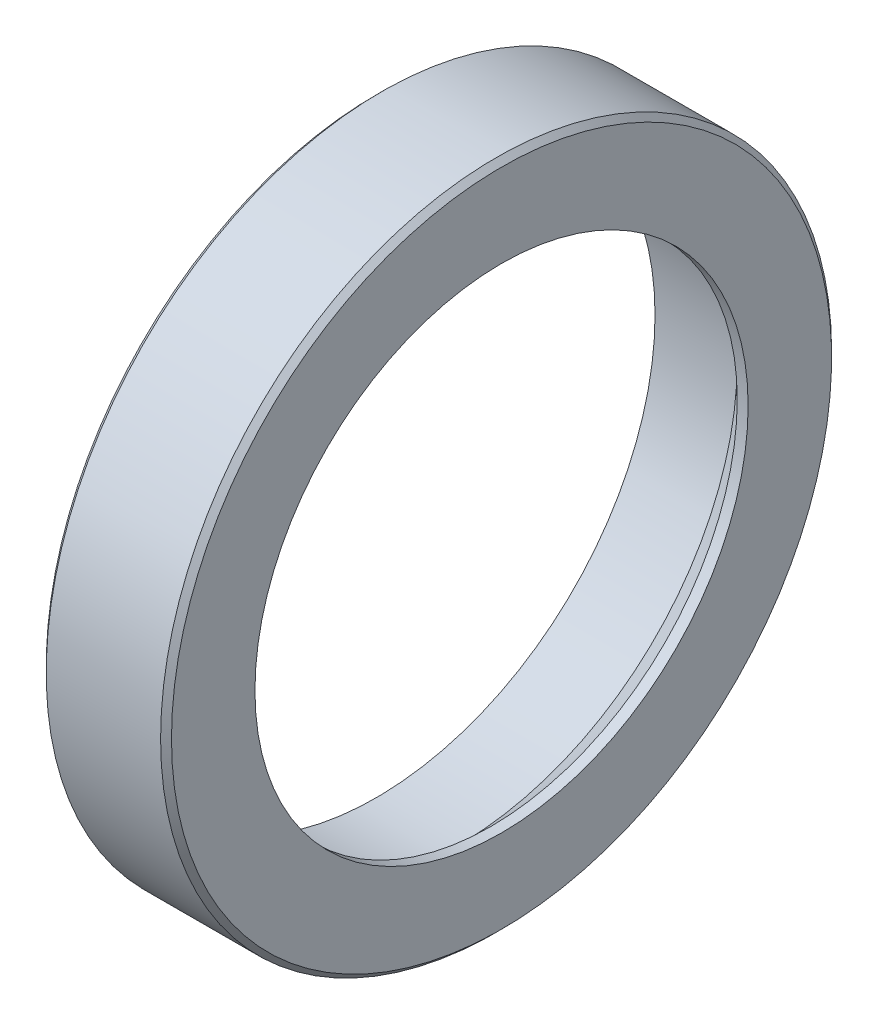
ISO-10303-21;
HEADER;
FILE_DESCRIPTION(('STEP AP214'),'2;1');
FILE_NAME('part.step','',(''),(''),'','','');
FILE_SCHEMA(('AUTOMOTIVE_DESIGN { 1 0 10303 214 1 1 1 1 }'));
ENDSEC;
DATA;
#1=APPLICATION_CONTEXT('core data for automotive mechanical design processes');
#2=APPLICATION_PROTOCOL_DEFINITION('international standard','automotive_design',2000,#1);
#3=PRODUCT_CONTEXT('',#1,'mechanical');
#4=PRODUCT('Part','Part','',(#3));
#5=PRODUCT_RELATED_PRODUCT_CATEGORY('part','',(#4));
#6=PRODUCT_DEFINITION_FORMATION('','',#4);
#7=PRODUCT_DEFINITION_CONTEXT('part definition',#1,'design');
#8=PRODUCT_DEFINITION('design','',#6,#7);
#9=PRODUCT_DEFINITION_SHAPE('','',#8);
#10=(LENGTH_UNIT() NAMED_UNIT(*) SI_UNIT(.MILLI.,.METRE.));
#11=(NAMED_UNIT(*) PLANE_ANGLE_UNIT() SI_UNIT($,.RADIAN.));
#12=(NAMED_UNIT(*) SI_UNIT($,.STERADIAN.) SOLID_ANGLE_UNIT());
#13=UNCERTAINTY_MEASURE_WITH_UNIT(LENGTH_MEASURE(1.E-05),#10,'distance_accuracy_value','');
#14=(GEOMETRIC_REPRESENTATION_CONTEXT(3) GLOBAL_UNCERTAINTY_ASSIGNED_CONTEXT((#13)) GLOBAL_UNIT_ASSIGNED_CONTEXT((#10,
#11,#12)) REPRESENTATION_CONTEXT('',''));
#15=CARTESIAN_POINT('',(0.,0.,0.));
#16=DIRECTION('',(0.,0.,1.));
#17=DIRECTION('',(1.,0.,0.));
#18=AXIS2_PLACEMENT_3D('',#15,#16,#17);
#19=CARTESIAN_POINT('',(61.6210605092657,0.,0.));
#20=DIRECTION('',(-1.,0.,0.));
#21=DIRECTION('',(0.,0.,1.));
#22=AXIS2_PLACEMENT_3D('',#19,#20,#21);
#23=CONICAL_SURFACE('',#22,19.5,0.785398163397447);
#24=CARTESIAN_POINT('',(61.6210605092657,0.,0.));
#25=DIRECTION('',(1.,0.,0.));
#26=DIRECTION('',(0.,0.,-1.));
#27=AXIS2_PLACEMENT_3D('',#24,#25,#26);
#28=CIRCLE('',#27,19.5);
#29=CARTESIAN_POINT('',(61.6210605092657,0.,-19.5));
#30=VERTEX_POINT('',#29);
#31=EDGE_CURVE('E34',#30,#30,#28,.F.);
#32=ORIENTED_EDGE('',*,*,#31,.T.);
#33=EDGE_LOOP('',(#32));
#34=FACE_BOUND('',#33,.T.);
#35=CARTESIAN_POINT('',(63.8710605092657,0.,0.));
#36=DIRECTION('',(1.,0.,0.));
#37=DIRECTION('',(0.,0.,-1.));
#38=AXIS2_PLACEMENT_3D('',#35,#36,#37);
#39=CIRCLE('',#38,17.25);
#40=CARTESIAN_POINT('',(63.8710605092657,0.,-17.25));
#41=VERTEX_POINT('',#40);
#42=EDGE_CURVE('E37',#41,#41,#39,.T.);
#43=ORIENTED_EDGE('',*,*,#42,.T.);
#44=EDGE_LOOP('',(#43));
#45=FACE_BOUND('',#44,.T.);
#46=ADVANCED_FACE('F15',(#34,#45),#23,.F.);
#47=CARTESIAN_POINT('',(64.2520605092657,0.,0.));
#48=DIRECTION('',(1.,0.,0.));
#49=DIRECTION('',(0.,0.,-1.));
#50=AXIS2_PLACEMENT_3D('',#47,#48,#49);
#51=CYLINDRICAL_SURFACE('',#50,17.25);
#52=ORIENTED_EDGE('',*,*,#42,.F.);
#53=EDGE_LOOP('',(#52));
#54=FACE_BOUND('',#53,.T.);
#55=CARTESIAN_POINT('',(64.6330605092657,0.,0.));
#56=DIRECTION('',(1.,0.,0.));
#57=DIRECTION('',(0.,0.,-1.));
#58=AXIS2_PLACEMENT_3D('',#55,#56,#57);
#59=CIRCLE('',#58,17.25);
#60=CARTESIAN_POINT('',(64.6330605092657,0.,-17.25));
#61=VERTEX_POINT('',#60);
#62=EDGE_CURVE('E18',#61,#61,#59,.F.);
#63=ORIENTED_EDGE('',*,*,#62,.F.);
#64=EDGE_LOOP('',(#63));
#65=FACE_BOUND('',#64,.T.);
#66=ADVANCED_FACE('F54',(#54,#65),#51,.F.);
#67=CARTESIAN_POINT('',(58.7455486871305,0.,0.));
#68=DIRECTION('',(1.,0.,0.));
#69=DIRECTION('',(0.,0.,-1.));
#70=AXIS2_PLACEMENT_3D('',#67,#68,#69);
#71=CYLINDRICAL_SURFACE('',#70,19.5);
#72=CARTESIAN_POINT('',(55.8700368649953,0.,0.));
#73=DIRECTION('',(1.,0.,0.));
#74=DIRECTION('',(0.,0.,-1.));
#75=AXIS2_PLACEMENT_3D('',#72,#73,#74);
#76=CIRCLE('',#75,19.5);
#77=CARTESIAN_POINT('',(55.8700368649953,0.,-19.5));
#78=VERTEX_POINT('',#77);
#79=EDGE_CURVE('E44',#78,#78,#76,.T.);
#80=ORIENTED_EDGE('',*,*,#79,.F.);
#81=EDGE_LOOP('',(#80));
#82=FACE_BOUND('',#81,.T.);
#83=ORIENTED_EDGE('',*,*,#31,.F.);
#84=EDGE_LOOP('',(#83));
#85=FACE_BOUND('',#84,.T.);
#86=ADVANCED_FACE('F56',(#82,#85),#71,.F.);
#87=CARTESIAN_POINT('',(64.6330605092657,17.25,0.));
#88=DIRECTION('',(1.,0.,0.));
#89=DIRECTION('',(0.,0.,-1.));
#90=AXIS2_PLACEMENT_3D('',#87,#88,#89);
#91=PLANE('',#90);
#92=ORIENTED_EDGE('',*,*,#62,.T.);
#93=EDGE_LOOP('',(#92));
#94=FACE_BOUND('',#93,.T.);
#95=CARTESIAN_POINT('',(64.6330605092657,0.,0.));
#96=DIRECTION('',(-1.,0.,0.));
#97=DIRECTION('',(0.,0.,1.));
#98=AXIS2_PLACEMENT_3D('',#95,#96,#97);
#99=CIRCLE('',#98,23.0886);
#100=CARTESIAN_POINT('',(64.6330605092657,0.,23.0886));
#101=VERTEX_POINT('',#100);
#102=EDGE_CURVE('E42',#101,#101,#99,.T.);
#103=ORIENTED_EDGE('',*,*,#102,.F.);
#104=EDGE_LOOP('',(#103));
#105=FACE_BOUND('',#104,.T.);
#106=ADVANCED_FACE('F51',(#94,#105),#91,.T.);
#107=CARTESIAN_POINT('',(55.8700368649953,23.4696,0.));
#108=DIRECTION('',(-1.,0.,0.));
#109=DIRECTION('',(0.,0.,1.));
#110=AXIS2_PLACEMENT_3D('',#107,#108,#109);
#111=PLANE('',#110);
#112=ORIENTED_EDGE('',*,*,#79,.T.);
#113=EDGE_LOOP('',(#112));
#114=FACE_BOUND('',#113,.T.);
#115=CARTESIAN_POINT('',(55.8700368649953,0.,0.));
#116=DIRECTION('',(1.,0.,0.));
#117=DIRECTION('',(0.,0.,-1.));
#118=AXIS2_PLACEMENT_3D('',#115,#116,#117);
#119=CIRCLE('',#118,23.0886);
#120=CARTESIAN_POINT('',(55.8700368649953,0.,-23.0886));
#121=VERTEX_POINT('',#120);
#122=EDGE_CURVE('E27',#121,#121,#119,.T.);
#123=ORIENTED_EDGE('',*,*,#122,.F.);
#124=EDGE_LOOP('',(#123));
#125=FACE_BOUND('',#124,.T.);
#126=ADVANCED_FACE('F81',(#114,#125),#111,.T.);
#127=CARTESIAN_POINT('',(64.2520605092657,0.,0.));
#128=DIRECTION('',(-1.,0.,0.));
#129=DIRECTION('',(0.,0.,1.));
#130=AXIS2_PLACEMENT_3D('',#127,#128,#129);
#131=CONICAL_SURFACE('',#130,23.4696,0.785398163397444);
#132=CARTESIAN_POINT('',(64.2520605092657,0.,0.));
#133=DIRECTION('',(1.,0.,0.));
#134=DIRECTION('',(0.,0.,-1.));
#135=AXIS2_PLACEMENT_3D('',#132,#133,#134);
#136=CIRCLE('',#135,23.4696);
#137=CARTESIAN_POINT('',(64.2520605092657,0.,-23.4696));
#138=VERTEX_POINT('',#137);
#139=EDGE_CURVE('E22',#138,#138,#136,.F.);
#140=ORIENTED_EDGE('',*,*,#139,.F.);
#141=EDGE_LOOP('',(#140));
#142=FACE_BOUND('',#141,.T.);
#143=ORIENTED_EDGE('',*,*,#102,.T.);
#144=EDGE_LOOP('',(#143));
#145=FACE_BOUND('',#144,.T.);
#146=ADVANCED_FACE('F74',(#142,#145),#131,.T.);
#147=CARTESIAN_POINT('',(56.2510368649953,0.,0.));
#148=DIRECTION('',(1.,0.,0.));
#149=DIRECTION('',(0.,0.,-1.));
#150=AXIS2_PLACEMENT_3D('',#147,#148,#149);
#151=CONICAL_SURFACE('',#150,23.4696,0.785398163397444);
#152=ORIENTED_EDGE('',*,*,#122,.T.);
#153=EDGE_LOOP('',(#152));
#154=FACE_BOUND('',#153,.T.);
#155=CARTESIAN_POINT('',(56.2510368649953,0.,0.));
#156=DIRECTION('',(1.,0.,0.));
#157=DIRECTION('',(0.,0.,-1.));
#158=AXIS2_PLACEMENT_3D('',#155,#156,#157);
#159=CIRCLE('',#158,23.4696);
#160=CARTESIAN_POINT('',(56.2510368649953,0.,-23.4696));
#161=VERTEX_POINT('',#160);
#162=EDGE_CURVE('E10',#161,#161,#159,.T.);
#163=ORIENTED_EDGE('',*,*,#162,.F.);
#164=EDGE_LOOP('',(#163));
#165=FACE_BOUND('',#164,.T.);
#166=ADVANCED_FACE('F69',(#154,#165),#151,.T.);
#167=CARTESIAN_POINT('',(60.2515486871305,0.,0.));
#168=DIRECTION('',(1.,0.,0.));
#169=DIRECTION('',(0.,0.,-1.));
#170=AXIS2_PLACEMENT_3D('',#167,#168,#169);
#171=CYLINDRICAL_SURFACE('',#170,23.4696);
#172=ORIENTED_EDGE('',*,*,#162,.T.);
#173=EDGE_LOOP('',(#172));
#174=FACE_BOUND('',#173,.T.);
#175=ORIENTED_EDGE('',*,*,#139,.T.);
#176=EDGE_LOOP('',(#175));
#177=FACE_BOUND('',#176,.T.);
#178=ADVANCED_FACE('F67',(#174,#177),#171,.T.);
#179=CLOSED_SHELL('',(#46,#66,#86,#106,#126,#146,#166,#178));
#180=MANIFOLD_SOLID_BREP('B1',#179);
#181=ADVANCED_BREP_SHAPE_REPRESENTATION('',(#18,#180),#14);
#182=SHAPE_DEFINITION_REPRESENTATION(#9,#181);
ENDSEC;
END-ISO-10303-21;
